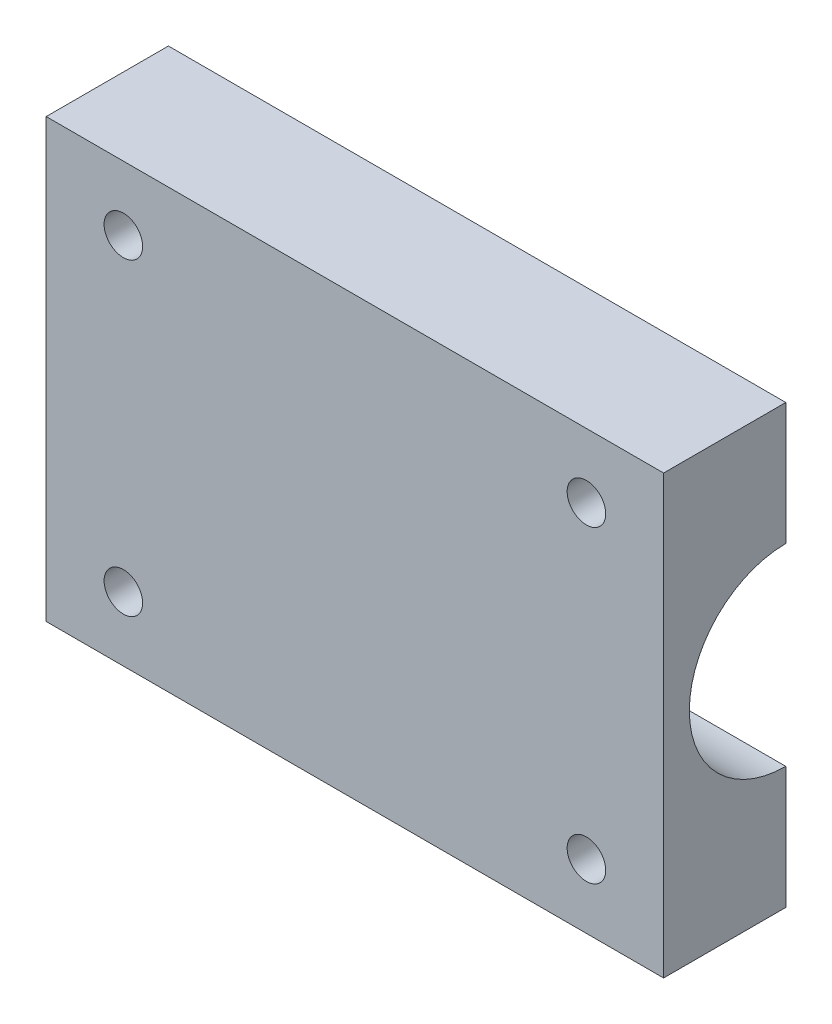
ISO-10303-21;
HEADER;
FILE_DESCRIPTION(('STEP AP214'),'2;1');
FILE_NAME('part.step','',(''),(''),'','','');
FILE_SCHEMA(('AUTOMOTIVE_DESIGN { 1 0 10303 214 1 1 1 1 }'));
ENDSEC;
DATA;
#1=APPLICATION_CONTEXT('core data for automotive mechanical design processes');
#2=APPLICATION_PROTOCOL_DEFINITION('international standard','automotive_design',2000,#1);
#3=PRODUCT_CONTEXT('',#1,'mechanical');
#4=PRODUCT('Part','Part','',(#3));
#5=PRODUCT_RELATED_PRODUCT_CATEGORY('part','',(#4));
#6=PRODUCT_DEFINITION_FORMATION('','',#4);
#7=PRODUCT_DEFINITION_CONTEXT('part definition',#1,'design');
#8=PRODUCT_DEFINITION('design','',#6,#7);
#9=PRODUCT_DEFINITION_SHAPE('','',#8);
#10=(LENGTH_UNIT() NAMED_UNIT(*) SI_UNIT(.MILLI.,.METRE.));
#11=(NAMED_UNIT(*) PLANE_ANGLE_UNIT() SI_UNIT($,.RADIAN.));
#12=(NAMED_UNIT(*) SI_UNIT($,.STERADIAN.) SOLID_ANGLE_UNIT());
#13=UNCERTAINTY_MEASURE_WITH_UNIT(LENGTH_MEASURE(1.E-05),#10,'distance_accuracy_value','');
#14=(GEOMETRIC_REPRESENTATION_CONTEXT(3) GLOBAL_UNCERTAINTY_ASSIGNED_CONTEXT((#13)) GLOBAL_UNIT_ASSIGNED_CONTEXT((#10,
#11,#12)) REPRESENTATION_CONTEXT('',''));
#15=CARTESIAN_POINT('',(0.,0.,0.));
#16=DIRECTION('',(0.,0.,1.));
#17=DIRECTION('',(1.,0.,0.));
#18=AXIS2_PLACEMENT_3D('',#15,#16,#17);
#19=CARTESIAN_POINT('',(0.,0.,0.));
#20=DIRECTION('',(0.,0.,1.));
#21=DIRECTION('',(1.,0.,0.));
#22=AXIS2_PLACEMENT_3D('',#19,#20,#21);
#23=PLANE('',#22);
#24=CARTESIAN_POINT('',(-18.0428571428571,-12.3642857142857,0.));
#25=DIRECTION('',(0.,0.,1.));
#26=DIRECTION('',(1.,0.,0.));
#27=AXIS2_PLACEMENT_3D('',#24,#25,#26);
#28=CIRCLE('',#27,1.5);
#29=CARTESIAN_POINT('',(-16.5428571428571,-12.3642857142857,0.));
#30=VERTEX_POINT('',#29);
#31=EDGE_CURVE('E127',#30,#30,#28,.T.);
#32=ORIENTED_EDGE('',*,*,#31,.T.);
#33=EDGE_LOOP('',(#32));
#34=FACE_BOUND('',#33,.T.);
#35=CARTESIAN_POINT('',(17.9571428571429,-12.3642857142857,0.));
#36=DIRECTION('',(0.,0.,1.));
#37=DIRECTION('',(1.,0.,0.));
#38=AXIS2_PLACEMENT_3D('',#35,#36,#37);
#39=CIRCLE('',#38,1.5);
#40=CARTESIAN_POINT('',(19.4571428571429,-12.3642857142857,0.));
#41=VERTEX_POINT('',#40);
#42=EDGE_CURVE('E124',#41,#41,#39,.T.);
#43=ORIENTED_EDGE('',*,*,#42,.T.);
#44=EDGE_LOOP('',(#43));
#45=FACE_BOUND('',#44,.T.);
#46=DIRECTION('',(0.,-1.,0.));
#47=VECTOR('',#46,1.);
#48=CARTESIAN_POINT('',(-24.0428571428571,0.,0.));
#49=LINE('',#48,#47);
#50=CARTESIAN_POINT('',(-24.0428571428571,-7.86428571428573,0.));
#51=VERTEX_POINT('',#50);
#52=CARTESIAN_POINT('',(-24.0428571428571,-17.3642857142857,0.));
#53=VERTEX_POINT('',#52);
#54=EDGE_CURVE('E143',#51,#53,#49,.T.);
#55=ORIENTED_EDGE('',*,*,#54,.F.);
#56=DIRECTION('',(1.,0.,0.));
#57=VECTOR('',#56,1.);
#58=CARTESIAN_POINT('',(-30.5428571428572,-7.86428571428574,0.));
#59=LINE('',#58,#57);
#60=CARTESIAN_POINT('',(23.9571428571429,-7.86428571428571,0.));
#61=VERTEX_POINT('',#60);
#62=EDGE_CURVE('E11',#51,#61,#59,.T.);
#63=ORIENTED_EDGE('',*,*,#62,.T.);
#64=DIRECTION('',(0.,-1.,0.));
#65=VECTOR('',#64,1.);
#66=CARTESIAN_POINT('',(23.9571428571429,0.,0.));
#67=LINE('',#66,#65);
#68=CARTESIAN_POINT('',(23.9571428571429,-17.3642857142857,0.));
#69=VERTEX_POINT('',#68);
#70=EDGE_CURVE('E107',#61,#69,#67,.T.);
#71=ORIENTED_EDGE('',*,*,#70,.T.);
#72=DIRECTION('',(1.,0.,0.));
#73=VECTOR('',#72,1.);
#74=CARTESIAN_POINT('',(0.,-17.3642857142857,0.));
#75=LINE('',#74,#73);
#76=EDGE_CURVE('E115',#53,#69,#75,.T.);
#77=ORIENTED_EDGE('',*,*,#76,.F.);
#78=EDGE_LOOP('',(#55,#63,#71,#77));
#79=FACE_BOUND('',#78,.T.);
#80=ADVANCED_FACE('F35',(#34,#45,#79),#23,.F.);
#81=CARTESIAN_POINT('',(-24.0428571428571,0.,9.5));
#82=DIRECTION('',(1.,0.,0.));
#83=DIRECTION('',(0.,0.,-1.));
#84=AXIS2_PLACEMENT_3D('',#81,#82,#83);
#85=PLANE('',#84);
#86=CARTESIAN_POINT('',(-24.0428571428571,16.6357142857143,0.));
#87=VERTEX_POINT('',#86);
#88=CARTESIAN_POINT('',(-24.0428571428571,7.13571428571428,0.));
#89=VERTEX_POINT('',#88);
#90=EDGE_CURVE('E145',#87,#89,#49,.T.);
#91=ORIENTED_EDGE('',*,*,#90,.T.);
#92=CARTESIAN_POINT('',(-24.0428571428571,-0.364285714285733,0.));
#93=DIRECTION('',(1.,0.,0.));
#94=DIRECTION('',(0.,0.,-1.));
#95=AXIS2_PLACEMENT_3D('',#92,#93,#94);
#96=CIRCLE('',#95,7.5);
#97=EDGE_CURVE('E50',#89,#51,#96,.T.);
#98=ORIENTED_EDGE('',*,*,#97,.T.);
#99=ORIENTED_EDGE('',*,*,#54,.T.);
#100=DIRECTION('',(0.,0.,-1.));
#101=VECTOR('',#100,1.);
#102=CARTESIAN_POINT('',(-24.0428571428571,-17.3642857142857,9.5));
#103=LINE('',#102,#101);
#104=CARTESIAN_POINT('',(-24.0428571428571,-17.3642857142857,9.5));
#105=VERTEX_POINT('',#104);
#106=EDGE_CURVE('E99',#105,#53,#103,.T.);
#107=ORIENTED_EDGE('',*,*,#106,.F.);
#108=DIRECTION('',(0.,-1.,0.));
#109=VECTOR('',#108,1.);
#110=CARTESIAN_POINT('',(-24.0428571428571,0.,9.5));
#111=LINE('',#110,#109);
#112=CARTESIAN_POINT('',(-24.0428571428571,16.6357142857143,9.5));
#113=VERTEX_POINT('',#112);
#114=EDGE_CURVE('E130',#113,#105,#111,.T.);
#115=ORIENTED_EDGE('',*,*,#114,.F.);
#116=DIRECTION('',(0.,0.,-1.));
#117=VECTOR('',#116,1.);
#118=CARTESIAN_POINT('',(-24.0428571428571,16.6357142857143,9.5));
#119=LINE('',#118,#117);
#120=EDGE_CURVE('E59',#113,#87,#119,.T.);
#121=ORIENTED_EDGE('',*,*,#120,.T.);
#122=EDGE_LOOP('',(#91,#98,#99,#107,#115,#121));
#123=FACE_BOUND('',#122,.T.);
#124=ADVANCED_FACE('F37',(#123),#85,.F.);
#125=CARTESIAN_POINT('',(0.,-17.3642857142857,9.5));
#126=DIRECTION('',(0.,1.,0.));
#127=DIRECTION('',(0.,0.,1.));
#128=AXIS2_PLACEMENT_3D('',#125,#126,#127);
#129=PLANE('',#128);
#130=ORIENTED_EDGE('',*,*,#76,.T.);
#131=DIRECTION('',(0.,0.,-1.));
#132=VECTOR('',#131,1.);
#133=CARTESIAN_POINT('',(23.9571428571429,-17.3642857142857,9.5));
#134=LINE('',#133,#132);
#135=CARTESIAN_POINT('',(23.9571428571429,-17.3642857142857,9.5));
#136=VERTEX_POINT('',#135);
#137=EDGE_CURVE('E135',#136,#69,#134,.T.);
#138=ORIENTED_EDGE('',*,*,#137,.F.);
#139=DIRECTION('',(1.,0.,0.));
#140=VECTOR('',#139,1.);
#141=CARTESIAN_POINT('',(0.,-17.3642857142857,9.5));
#142=LINE('',#141,#140);
#143=EDGE_CURVE('E86',#105,#136,#142,.T.);
#144=ORIENTED_EDGE('',*,*,#143,.F.);
#145=ORIENTED_EDGE('',*,*,#106,.T.);
#146=EDGE_LOOP('',(#130,#138,#144,#145));
#147=FACE_BOUND('',#146,.T.);
#148=ADVANCED_FACE('F139',(#147),#129,.F.);
#149=CARTESIAN_POINT('',(23.9571428571429,0.,9.5));
#150=DIRECTION('',(1.,0.,0.));
#151=DIRECTION('',(0.,1.,0.));
#152=AXIS2_PLACEMENT_3D('',#149,#150,#151);
#153=PLANE('',#152);
#154=CARTESIAN_POINT('',(23.9571428571429,-0.364285714285713,0.));
#155=DIRECTION('',(1.,0.,0.));
#156=DIRECTION('',(0.,1.,0.));
#157=AXIS2_PLACEMENT_3D('',#154,#155,#156);
#158=CIRCLE('',#157,7.5);
#159=CARTESIAN_POINT('',(23.9571428571429,7.13571428571429,0.));
#160=VERTEX_POINT('',#159);
#161=EDGE_CURVE('E96',#160,#61,#158,.T.);
#162=ORIENTED_EDGE('',*,*,#161,.F.);
#163=CARTESIAN_POINT('',(23.9571428571429,16.6357142857143,0.));
#164=VERTEX_POINT('',#163);
#165=EDGE_CURVE('E104',#164,#160,#67,.T.);
#166=ORIENTED_EDGE('',*,*,#165,.F.);
#167=DIRECTION('',(0.,0.,-1.));
#168=VECTOR('',#167,1.);
#169=CARTESIAN_POINT('',(23.9571428571429,16.6357142857143,9.5));
#170=LINE('',#169,#168);
#171=CARTESIAN_POINT('',(23.9571428571429,16.6357142857143,9.5));
#172=VERTEX_POINT('',#171);
#173=EDGE_CURVE('E132',#172,#164,#170,.T.);
#174=ORIENTED_EDGE('',*,*,#173,.F.);
#175=DIRECTION('',(0.,-1.,0.));
#176=VECTOR('',#175,1.);
#177=CARTESIAN_POINT('',(23.9571428571429,0.,9.5));
#178=LINE('',#177,#176);
#179=EDGE_CURVE('E160',#172,#136,#178,.T.);
#180=ORIENTED_EDGE('',*,*,#179,.T.);
#181=ORIENTED_EDGE('',*,*,#137,.T.);
#182=ORIENTED_EDGE('',*,*,#70,.F.);
#183=EDGE_LOOP('',(#162,#166,#174,#180,#181,#182));
#184=FACE_BOUND('',#183,.T.);
#185=ADVANCED_FACE('F103',(#184),#153,.T.);
#186=CARTESIAN_POINT('',(17.9571428571429,-12.3642857142857,9.5));
#187=DIRECTION('',(0.,0.,-1.));
#188=DIRECTION('',(-1.,0.,0.));
#189=AXIS2_PLACEMENT_3D('',#186,#187,#188);
#190=CYLINDRICAL_SURFACE('',#189,1.5);
#191=CARTESIAN_POINT('',(17.9571428571429,-12.3642857142857,9.5));
#192=DIRECTION('',(0.,0.,1.));
#193=DIRECTION('',(1.,0.,0.));
#194=AXIS2_PLACEMENT_3D('',#191,#192,#193);
#195=CIRCLE('',#194,1.5);
#196=CARTESIAN_POINT('',(19.4571428571429,-12.3642857142857,9.5));
#197=VERTEX_POINT('',#196);
#198=EDGE_CURVE('E149',#197,#197,#195,.T.);
#199=ORIENTED_EDGE('',*,*,#198,.T.);
#200=EDGE_LOOP('',(#199));
#201=FACE_BOUND('',#200,.T.);
#202=ORIENTED_EDGE('',*,*,#42,.F.);
#203=EDGE_LOOP('',(#202));
#204=FACE_BOUND('',#203,.T.);
#205=ADVANCED_FACE('F224',(#201,#204),#190,.F.);
#206=CARTESIAN_POINT('',(17.9571428571429,11.6357142857143,9.5));
#207=DIRECTION('',(0.,0.,-1.));
#208=DIRECTION('',(-1.,0.,0.));
#209=AXIS2_PLACEMENT_3D('',#206,#207,#208);
#210=CYLINDRICAL_SURFACE('',#209,1.5);
#211=CARTESIAN_POINT('',(17.9571428571429,11.6357142857143,9.5));
#212=DIRECTION('',(0.,0.,1.));
#213=DIRECTION('',(1.,0.,0.));
#214=AXIS2_PLACEMENT_3D('',#211,#212,#213);
#215=CIRCLE('',#214,1.5);
#216=CARTESIAN_POINT('',(19.4571428571429,11.6357142857143,9.5));
#217=VERTEX_POINT('',#216);
#218=EDGE_CURVE('E152',#217,#217,#215,.T.);
#219=ORIENTED_EDGE('',*,*,#218,.T.);
#220=EDGE_LOOP('',(#219));
#221=FACE_BOUND('',#220,.T.);
#222=CARTESIAN_POINT('',(17.9571428571429,11.6357142857143,0.));
#223=DIRECTION('',(0.,0.,1.));
#224=DIRECTION('',(1.,0.,0.));
#225=AXIS2_PLACEMENT_3D('',#222,#223,#224);
#226=CIRCLE('',#225,1.5);
#227=CARTESIAN_POINT('',(19.4571428571429,11.6357142857143,0.));
#228=VERTEX_POINT('',#227);
#229=EDGE_CURVE('E121',#228,#228,#226,.T.);
#230=ORIENTED_EDGE('',*,*,#229,.F.);
#231=EDGE_LOOP('',(#230));
#232=FACE_BOUND('',#231,.T.);
#233=ADVANCED_FACE('F180',(#221,#232),#210,.F.);
#234=CARTESIAN_POINT('',(-18.0428571428571,11.6357142857143,9.5));
#235=DIRECTION('',(0.,0.,-1.));
#236=DIRECTION('',(-1.,0.,0.));
#237=AXIS2_PLACEMENT_3D('',#234,#235,#236);
#238=CYLINDRICAL_SURFACE('',#237,1.5);
#239=CARTESIAN_POINT('',(-18.0428571428571,11.6357142857143,9.5));
#240=DIRECTION('',(0.,0.,1.));
#241=DIRECTION('',(1.,0.,0.));
#242=AXIS2_PLACEMENT_3D('',#239,#240,#241);
#243=CIRCLE('',#242,1.5);
#244=CARTESIAN_POINT('',(-16.5428571428571,11.6357142857143,9.5));
#245=VERTEX_POINT('',#244);
#246=EDGE_CURVE('E155',#245,#245,#243,.T.);
#247=ORIENTED_EDGE('',*,*,#246,.T.);
#248=EDGE_LOOP('',(#247));
#249=FACE_BOUND('',#248,.T.);
#250=CARTESIAN_POINT('',(-18.0428571428571,11.6357142857143,0.));
#251=DIRECTION('',(0.,0.,1.));
#252=DIRECTION('',(1.,0.,0.));
#253=AXIS2_PLACEMENT_3D('',#250,#251,#252);
#254=CIRCLE('',#253,1.5);
#255=CARTESIAN_POINT('',(-16.5428571428571,11.6357142857143,0.));
#256=VERTEX_POINT('',#255);
#257=EDGE_CURVE('E113',#256,#256,#254,.T.);
#258=ORIENTED_EDGE('',*,*,#257,.F.);
#259=EDGE_LOOP('',(#258));
#260=FACE_BOUND('',#259,.T.);
#261=ADVANCED_FACE('F172',(#249,#260),#238,.F.);
#262=CARTESIAN_POINT('',(0.,16.6357142857143,9.5));
#263=DIRECTION('',(0.,1.,0.));
#264=DIRECTION('',(0.,0.,1.));
#265=AXIS2_PLACEMENT_3D('',#262,#263,#264);
#266=PLANE('',#265);
#267=DIRECTION('',(1.,0.,0.));
#268=VECTOR('',#267,1.);
#269=CARTESIAN_POINT('',(0.,16.6357142857143,0.));
#270=LINE('',#269,#268);
#271=EDGE_CURVE('E111',#87,#164,#270,.T.);
#272=ORIENTED_EDGE('',*,*,#271,.F.);
#273=ORIENTED_EDGE('',*,*,#120,.F.);
#274=DIRECTION('',(1.,0.,0.));
#275=VECTOR('',#274,1.);
#276=CARTESIAN_POINT('',(0.,16.6357142857143,9.5));
#277=LINE('',#276,#275);
#278=EDGE_CURVE('E158',#113,#172,#277,.T.);
#279=ORIENTED_EDGE('',*,*,#278,.T.);
#280=ORIENTED_EDGE('',*,*,#173,.T.);
#281=EDGE_LOOP('',(#272,#273,#279,#280));
#282=FACE_BOUND('',#281,.T.);
#283=ADVANCED_FACE('F169',(#282),#266,.T.);
#284=CARTESIAN_POINT('',(-18.0428571428571,-12.3642857142857,9.5));
#285=DIRECTION('',(0.,0.,-1.));
#286=DIRECTION('',(-1.,0.,0.));
#287=AXIS2_PLACEMENT_3D('',#284,#285,#286);
#288=CYLINDRICAL_SURFACE('',#287,1.5);
#289=CARTESIAN_POINT('',(-18.0428571428571,-12.3642857142857,9.5));
#290=DIRECTION('',(0.,0.,1.));
#291=DIRECTION('',(1.,0.,0.));
#292=AXIS2_PLACEMENT_3D('',#289,#290,#291);
#293=CIRCLE('',#292,1.5);
#294=CARTESIAN_POINT('',(-16.5428571428571,-12.3642857142857,9.5));
#295=VERTEX_POINT('',#294);
#296=EDGE_CURVE('E133',#295,#295,#293,.T.);
#297=ORIENTED_EDGE('',*,*,#296,.T.);
#298=EDGE_LOOP('',(#297));
#299=FACE_BOUND('',#298,.T.);
#300=ORIENTED_EDGE('',*,*,#31,.F.);
#301=EDGE_LOOP('',(#300));
#302=FACE_BOUND('',#301,.T.);
#303=ADVANCED_FACE('F171',(#299,#302),#288,.F.);
#304=CARTESIAN_POINT('',(0.,0.,9.5));
#305=DIRECTION('',(0.,0.,1.));
#306=DIRECTION('',(1.,0.,0.));
#307=AXIS2_PLACEMENT_3D('',#304,#305,#306);
#308=PLANE('',#307);
#309=ORIENTED_EDGE('',*,*,#114,.T.);
#310=ORIENTED_EDGE('',*,*,#143,.T.);
#311=ORIENTED_EDGE('',*,*,#179,.F.);
#312=ORIENTED_EDGE('',*,*,#278,.F.);
#313=EDGE_LOOP('',(#309,#310,#311,#312));
#314=FACE_BOUND('',#313,.T.);
#315=ORIENTED_EDGE('',*,*,#246,.F.);
#316=EDGE_LOOP('',(#315));
#317=FACE_BOUND('',#316,.T.);
#318=ORIENTED_EDGE('',*,*,#218,.F.);
#319=EDGE_LOOP('',(#318));
#320=FACE_BOUND('',#319,.T.);
#321=ORIENTED_EDGE('',*,*,#198,.F.);
#322=EDGE_LOOP('',(#321));
#323=FACE_BOUND('',#322,.T.);
#324=ORIENTED_EDGE('',*,*,#296,.F.);
#325=EDGE_LOOP('',(#324));
#326=FACE_BOUND('',#325,.T.);
#327=ADVANCED_FACE('F166',(#314,#317,#320,#323,#326),#308,.T.);
#328=ORIENTED_EDGE('',*,*,#165,.T.);
#329=DIRECTION('',(1.,0.,0.));
#330=VECTOR('',#329,1.);
#331=CARTESIAN_POINT('',(-30.5428571428572,7.13571428571426,0.));
#332=LINE('',#331,#330);
#333=EDGE_CURVE('E43',#160,#89,#332,.F.);
#334=ORIENTED_EDGE('',*,*,#333,.T.);
#335=ORIENTED_EDGE('',*,*,#90,.F.);
#336=ORIENTED_EDGE('',*,*,#271,.T.);
#337=EDGE_LOOP('',(#328,#334,#335,#336));
#338=FACE_BOUND('',#337,.T.);
#339=ORIENTED_EDGE('',*,*,#257,.T.);
#340=EDGE_LOOP('',(#339));
#341=FACE_BOUND('',#340,.T.);
#342=ORIENTED_EDGE('',*,*,#229,.T.);
#343=EDGE_LOOP('',(#342));
#344=FACE_BOUND('',#343,.T.);
#345=ADVANCED_FACE('F109',(#338,#341,#344),#23,.F.);
#346=CARTESIAN_POINT('',(-30.5428571428572,-0.364285714285736,0.));
#347=DIRECTION('',(1.,0.,0.));
#348=DIRECTION('',(0.,1.,0.));
#349=AXIS2_PLACEMENT_3D('',#346,#347,#348);
#350=CYLINDRICAL_SURFACE('',#349,7.5);
#351=ORIENTED_EDGE('',*,*,#97,.F.);
#352=ORIENTED_EDGE('',*,*,#333,.F.);
#353=ORIENTED_EDGE('',*,*,#161,.T.);
#354=ORIENTED_EDGE('',*,*,#62,.F.);
#355=EDGE_LOOP('',(#351,#352,#353,#354));
#356=FACE_BOUND('',#355,.T.);
#357=ADVANCED_FACE('F95',(#356),#350,.F.);
#358=CLOSED_SHELL('',(#80,#124,#148,#185,#205,#233,#261,#283,#303,#327,#345,#357));
#359=MANIFOLD_SOLID_BREP('B2',#358);
#360=ADVANCED_BREP_SHAPE_REPRESENTATION('',(#18,#359),#14);
#361=SHAPE_DEFINITION_REPRESENTATION(#9,#360);
ENDSEC;
END-ISO-10303-21;
